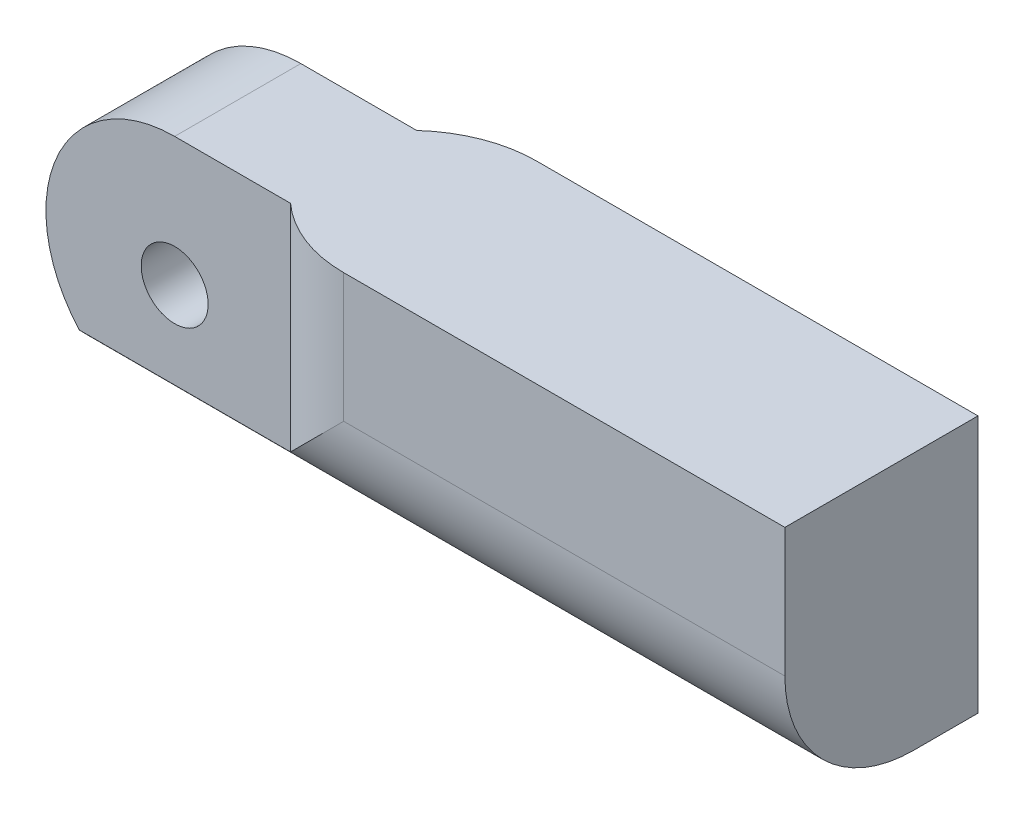
ISO-10303-21;
HEADER;
FILE_DESCRIPTION(('STEP AP214'),'2;1');
FILE_NAME('part.step','',(''),(''),'','','');
FILE_SCHEMA(('AUTOMOTIVE_DESIGN { 1 0 10303 214 1 1 1 1 }'));
ENDSEC;
DATA;
#1=APPLICATION_CONTEXT('core data for automotive mechanical design processes');
#2=APPLICATION_PROTOCOL_DEFINITION('international standard','automotive_design',2000,#1);
#3=PRODUCT_CONTEXT('',#1,'mechanical');
#4=PRODUCT('Part','Part','',(#3));
#5=PRODUCT_RELATED_PRODUCT_CATEGORY('part','',(#4));
#6=PRODUCT_DEFINITION_FORMATION('','',#4);
#7=PRODUCT_DEFINITION_CONTEXT('part definition',#1,'design');
#8=PRODUCT_DEFINITION('design','',#6,#7);
#9=PRODUCT_DEFINITION_SHAPE('','',#8);
#10=(LENGTH_UNIT() NAMED_UNIT(*) SI_UNIT(.MILLI.,.METRE.));
#11=(NAMED_UNIT(*) PLANE_ANGLE_UNIT() SI_UNIT($,.RADIAN.));
#12=(NAMED_UNIT(*) SI_UNIT($,.STERADIAN.) SOLID_ANGLE_UNIT());
#13=UNCERTAINTY_MEASURE_WITH_UNIT(LENGTH_MEASURE(1.E-05),#10,'distance_accuracy_value','');
#14=(GEOMETRIC_REPRESENTATION_CONTEXT(3) GLOBAL_UNCERTAINTY_ASSIGNED_CONTEXT((#13)) GLOBAL_UNIT_ASSIGNED_CONTEXT((#10,
#11,#12)) REPRESENTATION_CONTEXT('',''));
#15=CARTESIAN_POINT('',(0.,0.,0.));
#16=DIRECTION('',(0.,0.,1.));
#17=DIRECTION('',(1.,0.,0.));
#18=AXIS2_PLACEMENT_3D('',#15,#16,#17);
#19=CARTESIAN_POINT('',(0.,10.,4.9));
#20=DIRECTION('',(0.,1.,0.));
#21=DIRECTION('',(0.,0.,1.));
#22=AXIS2_PLACEMENT_3D('',#19,#20,#21);
#23=PLANE('',#22);
#24=DIRECTION('',(1.,0.,0.));
#25=VECTOR('',#24,1.);
#26=CARTESIAN_POINT('',(0.,10.,-7.5));
#27=LINE('',#26,#25);
#28=CARTESIAN_POINT('',(15.7260686883201,10.,-7.5));
#29=VERTEX_POINT('',#28);
#30=CARTESIAN_POINT('',(50.,10.,-7.5));
#31=VERTEX_POINT('',#30);
#32=EDGE_CURVE('E141',#29,#31,#27,.T.);
#33=ORIENTED_EDGE('',*,*,#32,.F.);
#34=CARTESIAN_POINT('',(15.7260686883201,10.,2.5));
#35=DIRECTION('',(0.,1.,0.));
#36=DIRECTION('',(0.,0.,1.));
#37=AXIS2_PLACEMENT_3D('',#34,#35,#36);
#38=CIRCLE('',#37,10.);
#39=CARTESIAN_POINT('',(9.,10.,-4.9));
#40=VERTEX_POINT('',#39);
#41=EDGE_CURVE('E11',#29,#40,#38,.T.);
#42=ORIENTED_EDGE('',*,*,#41,.T.);
#43=DIRECTION('',(1.,0.,0.));
#44=VECTOR('',#43,1.);
#45=CARTESIAN_POINT('',(0.,10.,-4.9));
#46=LINE('',#45,#44);
#47=CARTESIAN_POINT('',(0.,10.,-4.9));
#48=VERTEX_POINT('',#47);
#49=EDGE_CURVE('E172',#48,#40,#46,.T.);
#50=ORIENTED_EDGE('',*,*,#49,.F.);
#51=DIRECTION('',(0.,0.,-1.));
#52=VECTOR('',#51,1.);
#53=CARTESIAN_POINT('',(0.,10.,4.9));
#54=LINE('',#53,#52);
#55=CARTESIAN_POINT('',(0.,10.,4.9));
#56=VERTEX_POINT('',#55);
#57=EDGE_CURVE('E189',#56,#48,#54,.T.);
#58=ORIENTED_EDGE('',*,*,#57,.F.);
#59=DIRECTION('',(1.,0.,0.));
#60=VECTOR('',#59,1.);
#61=CARTESIAN_POINT('',(0.,10.,4.9));
#62=LINE('',#61,#60);
#63=CARTESIAN_POINT('',(9.,10.,4.9));
#64=VERTEX_POINT('',#63);
#65=EDGE_CURVE('E156',#56,#64,#62,.T.);
#66=ORIENTED_EDGE('',*,*,#65,.T.);
#67=CARTESIAN_POINT('',(15.7260686883201,10.,-2.5));
#68=DIRECTION('',(0.,1.,0.));
#69=DIRECTION('',(0.,0.,1.));
#70=AXIS2_PLACEMENT_3D('',#67,#68,#69);
#71=CIRCLE('',#70,10.);
#72=CARTESIAN_POINT('',(15.7260686883201,10.,7.5));
#73=VERTEX_POINT('',#72);
#74=EDGE_CURVE('E55',#64,#73,#71,.T.);
#75=ORIENTED_EDGE('',*,*,#74,.T.);
#76=DIRECTION('',(1.,0.,0.));
#77=VECTOR('',#76,1.);
#78=CARTESIAN_POINT('',(0.,10.,7.5));
#79=LINE('',#78,#77);
#80=CARTESIAN_POINT('',(50.,10.,7.5));
#81=VERTEX_POINT('',#80);
#82=EDGE_CURVE('E118',#73,#81,#79,.T.);
#83=ORIENTED_EDGE('',*,*,#82,.T.);
#84=DIRECTION('',(0.,0.,-1.));
#85=VECTOR('',#84,1.);
#86=CARTESIAN_POINT('',(50.,10.,7.5));
#87=LINE('',#86,#85);
#88=EDGE_CURVE('E120',#81,#31,#87,.T.);
#89=ORIENTED_EDGE('',*,*,#88,.T.);
#90=EDGE_LOOP('',(#33,#42,#50,#58,#66,#75,#83,#89));
#91=FACE_BOUND('',#90,.T.);
#92=ADVANCED_FACE('F45',(#91),#23,.T.);
#93=CARTESIAN_POINT('',(0.,0.,4.9));
#94=DIRECTION('',(0.,0.,-1.));
#95=DIRECTION('',(-1.,0.,0.));
#96=AXIS2_PLACEMENT_3D('',#93,#94,#95);
#97=CYLINDRICAL_SURFACE('',#96,10.);
#98=DIRECTION('',(0.,0.,-1.));
#99=VECTOR('',#98,1.);
#100=CARTESIAN_POINT('',(0.,-10.,4.9));
#101=LINE('',#100,#99);
#102=CARTESIAN_POINT('',(0.,-10.,-2.5));
#103=VERTEX_POINT('',#102);
#104=CARTESIAN_POINT('',(0.,-10.,-4.9));
#105=VERTEX_POINT('',#104);
#106=EDGE_CURVE('E168',#103,#105,#101,.T.);
#107=ORIENTED_EDGE('',*,*,#106,.F.);
#108=CARTESIAN_POINT('',(0.,0.,-2.5));
#109=DIRECTION('',(-0.707106781186547,0.,-0.707106781186547));
#110=DIRECTION('',(-0.707106781186547,0.,0.707106781186547));
#111=AXIS2_PLACEMENT_3D('',#108,#109,#110);
#112=ELLIPSE('',#111,14.1421356237309,10.);
#113=CARTESIAN_POINT('',(-7.4,-6.72606868832009,4.9));
#114=VERTEX_POINT('',#113);
#115=EDGE_CURVE('E199',#103,#114,#112,.T.);
#116=ORIENTED_EDGE('',*,*,#115,.T.);
#117=CARTESIAN_POINT('',(0.,0.,4.9));
#118=DIRECTION('',(0.,0.,1.));
#119=DIRECTION('',(1.,0.,0.));
#120=AXIS2_PLACEMENT_3D('',#117,#118,#119);
#121=CIRCLE('',#120,10.);
#122=EDGE_CURVE('E160',#56,#114,#121,.T.);
#123=ORIENTED_EDGE('',*,*,#122,.F.);
#124=ORIENTED_EDGE('',*,*,#57,.T.);
#125=CARTESIAN_POINT('',(0.,0.,-4.9));
#126=DIRECTION('',(0.,0.,1.));
#127=DIRECTION('',(1.,0.,0.));
#128=AXIS2_PLACEMENT_3D('',#125,#126,#127);
#129=CIRCLE('',#128,10.);
#130=EDGE_CURVE('E176',#48,#105,#129,.T.);
#131=ORIENTED_EDGE('',*,*,#130,.T.);
#132=EDGE_LOOP('',(#107,#116,#123,#124,#131));
#133=FACE_BOUND('',#132,.T.);
#134=ADVANCED_FACE('F227',(#133),#97,.T.);
#135=CARTESIAN_POINT('',(0.,-10.,4.9));
#136=DIRECTION('',(0.,-1.,0.));
#137=DIRECTION('',(1.,0.,0.));
#138=AXIS2_PLACEMENT_3D('',#135,#136,#137);
#139=PLANE('',#138);
#140=DIRECTION('',(0.,0.,-1.));
#141=VECTOR('',#140,1.);
#142=CARTESIAN_POINT('',(50.,-10.,7.5));
#143=LINE('',#142,#141);
#144=CARTESIAN_POINT('',(50.,-10.,-2.5));
#145=VERTEX_POINT('',#144);
#146=CARTESIAN_POINT('',(50.,-10.,-7.5));
#147=VERTEX_POINT('',#146);
#148=EDGE_CURVE('E134',#145,#147,#143,.T.);
#149=ORIENTED_EDGE('',*,*,#148,.F.);
#150=DIRECTION('',(-1.,0.,0.));
#151=VECTOR('',#150,1.);
#152=CARTESIAN_POINT('',(0.,-10.,-2.5));
#153=LINE('',#152,#151);
#154=EDGE_CURVE('E195',#145,#103,#153,.T.);
#155=ORIENTED_EDGE('',*,*,#154,.T.);
#156=ORIENTED_EDGE('',*,*,#106,.T.);
#157=DIRECTION('',(-1.,0.,0.));
#158=VECTOR('',#157,1.);
#159=CARTESIAN_POINT('',(0.,-10.,-4.9));
#160=LINE('',#159,#158);
#161=CARTESIAN_POINT('',(9.,-10.,-4.9));
#162=VERTEX_POINT('',#161);
#163=EDGE_CURVE('E180',#162,#105,#160,.T.);
#164=ORIENTED_EDGE('',*,*,#163,.F.);
#165=CARTESIAN_POINT('',(15.7260686883201,-10.,2.5));
#166=DIRECTION('',(0.,-1.,0.));
#167=DIRECTION('',(1.,0.,0.));
#168=AXIS2_PLACEMENT_3D('',#165,#166,#167);
#169=CIRCLE('',#168,10.);
#170=CARTESIAN_POINT('',(15.7260686883201,-10.,-7.5));
#171=VERTEX_POINT('',#170);
#172=EDGE_CURVE('E192',#162,#171,#169,.T.);
#173=ORIENTED_EDGE('',*,*,#172,.T.);
#174=DIRECTION('',(-1.,0.,0.));
#175=VECTOR('',#174,1.);
#176=CARTESIAN_POINT('',(0.,-10.,-7.5));
#177=LINE('',#176,#175);
#178=EDGE_CURVE('E144',#147,#171,#177,.T.);
#179=ORIENTED_EDGE('',*,*,#178,.F.);
#180=EDGE_LOOP('',(#149,#155,#156,#164,#173,#179));
#181=FACE_BOUND('',#180,.T.);
#182=ADVANCED_FACE('F220',(#181),#139,.T.);
#183=CARTESIAN_POINT('',(0.,0.,4.9));
#184=DIRECTION('',(0.,0.,-1.));
#185=DIRECTION('',(-1.,0.,0.));
#186=AXIS2_PLACEMENT_3D('',#183,#184,#185);
#187=CYLINDRICAL_SURFACE('',#186,2.6);
#188=CARTESIAN_POINT('',(0.,0.,4.9));
#189=DIRECTION('',(0.,0.,1.));
#190=DIRECTION('',(1.,0.,0.));
#191=AXIS2_PLACEMENT_3D('',#188,#189,#190);
#192=CIRCLE('',#191,2.6);
#193=CARTESIAN_POINT('',(2.6,0.,4.9));
#194=VERTEX_POINT('',#193);
#195=EDGE_CURVE('E152',#194,#194,#192,.T.);
#196=ORIENTED_EDGE('',*,*,#195,.T.);
#197=EDGE_LOOP('',(#196));
#198=FACE_BOUND('',#197,.T.);
#199=CARTESIAN_POINT('',(0.,0.,-4.9));
#200=DIRECTION('',(0.,0.,1.));
#201=DIRECTION('',(1.,0.,0.));
#202=AXIS2_PLACEMENT_3D('',#199,#200,#201);
#203=CIRCLE('',#202,2.6);
#204=CARTESIAN_POINT('',(2.6,0.,-4.9));
#205=VERTEX_POINT('',#204);
#206=EDGE_CURVE('E151',#205,#205,#203,.T.);
#207=ORIENTED_EDGE('',*,*,#206,.F.);
#208=EDGE_LOOP('',(#207));
#209=FACE_BOUND('',#208,.T.);
#210=ADVANCED_FACE('F255',(#198,#209),#187,.F.);
#211=CARTESIAN_POINT('',(0.,0.,4.9));
#212=DIRECTION('',(0.,0.,1.));
#213=DIRECTION('',(1.,0.,0.));
#214=AXIS2_PLACEMENT_3D('',#211,#212,#213);
#215=PLANE('',#214);
#216=ORIENTED_EDGE('',*,*,#195,.F.);
#217=EDGE_LOOP('',(#216));
#218=FACE_BOUND('',#217,.T.);
#219=ORIENTED_EDGE('',*,*,#122,.T.);
#220=DIRECTION('',(-1.,0.,0.));
#221=VECTOR('',#220,1.);
#222=CARTESIAN_POINT('',(-7.4,-6.72606868832009,4.9));
#223=LINE('',#222,#221);
#224=CARTESIAN_POINT('',(8.99999999999999,-6.72606868832009,4.9));
#225=VERTEX_POINT('',#224);
#226=EDGE_CURVE('E202',#114,#225,#223,.F.);
#227=ORIENTED_EDGE('',*,*,#226,.T.);
#228=DIRECTION('',(0.,-1.,0.));
#229=VECTOR('',#228,1.);
#230=CARTESIAN_POINT('',(9.,0.,4.9));
#231=LINE('',#230,#229);
#232=EDGE_CURVE('E164',#64,#225,#231,.T.);
#233=ORIENTED_EDGE('',*,*,#232,.F.);
#234=ORIENTED_EDGE('',*,*,#65,.F.);
#235=EDGE_LOOP('',(#219,#227,#233,#234));
#236=FACE_BOUND('',#235,.T.);
#237=ADVANCED_FACE('F230',(#218,#236),#215,.T.);
#238=CARTESIAN_POINT('',(0.,0.,-4.9));
#239=DIRECTION('',(0.,0.,1.));
#240=DIRECTION('',(1.,0.,0.));
#241=AXIS2_PLACEMENT_3D('',#238,#239,#240);
#242=PLANE('',#241);
#243=ORIENTED_EDGE('',*,*,#206,.T.);
#244=EDGE_LOOP('',(#243));
#245=FACE_BOUND('',#244,.T.);
#246=ORIENTED_EDGE('',*,*,#49,.T.);
#247=DIRECTION('',(0.,-1.,0.));
#248=VECTOR('',#247,1.);
#249=CARTESIAN_POINT('',(9.,0.,-4.9));
#250=LINE('',#249,#248);
#251=EDGE_CURVE('E157',#40,#162,#250,.T.);
#252=ORIENTED_EDGE('',*,*,#251,.T.);
#253=ORIENTED_EDGE('',*,*,#163,.T.);
#254=ORIENTED_EDGE('',*,*,#130,.F.);
#255=EDGE_LOOP('',(#246,#252,#253,#254));
#256=FACE_BOUND('',#255,.T.);
#257=ADVANCED_FACE('F235',(#245,#256),#242,.F.);
#258=CARTESIAN_POINT('',(50.,0.,7.5));
#259=DIRECTION('',(1.,0.,0.));
#260=DIRECTION('',(0.,0.,-1.));
#261=AXIS2_PLACEMENT_3D('',#258,#259,#260);
#262=PLANE('',#261);
#263=DIRECTION('',(0.,-1.,0.));
#264=VECTOR('',#263,1.);
#265=CARTESIAN_POINT('',(50.,0.,7.5));
#266=LINE('',#265,#264);
#267=CARTESIAN_POINT('',(50.,0.,7.5));
#268=VERTEX_POINT('',#267);
#269=EDGE_CURVE('E125',#81,#268,#266,.T.);
#270=ORIENTED_EDGE('',*,*,#269,.T.);
#271=CARTESIAN_POINT('',(50.,0.,-2.5));
#272=DIRECTION('',(1.,0.,0.));
#273=DIRECTION('',(0.,0.,-1.));
#274=AXIS2_PLACEMENT_3D('',#271,#272,#273);
#275=CIRCLE('',#274,10.);
#276=EDGE_CURVE('E209',#268,#145,#275,.T.);
#277=ORIENTED_EDGE('',*,*,#276,.T.);
#278=ORIENTED_EDGE('',*,*,#148,.T.);
#279=DIRECTION('',(0.,-1.,0.));
#280=VECTOR('',#279,1.);
#281=CARTESIAN_POINT('',(50.,0.,-7.5));
#282=LINE('',#281,#280);
#283=EDGE_CURVE('E126',#31,#147,#282,.T.);
#284=ORIENTED_EDGE('',*,*,#283,.F.);
#285=ORIENTED_EDGE('',*,*,#88,.F.);
#286=EDGE_LOOP('',(#270,#277,#278,#284,#285));
#287=FACE_BOUND('',#286,.T.);
#288=ADVANCED_FACE('F130',(#287),#262,.T.);
#289=CARTESIAN_POINT('',(0.,0.,7.5));
#290=DIRECTION('',(0.,0.,1.));
#291=DIRECTION('',(1.,0.,0.));
#292=AXIS2_PLACEMENT_3D('',#289,#290,#291);
#293=PLANE('',#292);
#294=DIRECTION('',(0.,1.,0.));
#295=VECTOR('',#294,1.);
#296=CARTESIAN_POINT('',(15.7260686883201,-10.,7.5));
#297=LINE('',#296,#295);
#298=CARTESIAN_POINT('',(15.7260686883201,0.,7.5));
#299=VERTEX_POINT('',#298);
#300=EDGE_CURVE('E70',#73,#299,#297,.F.);
#301=ORIENTED_EDGE('',*,*,#300,.T.);
#302=DIRECTION('',(-1.,0.,0.));
#303=VECTOR('',#302,1.);
#304=CARTESIAN_POINT('',(0.,0.,7.5));
#305=LINE('',#304,#303);
#306=EDGE_CURVE('E137',#299,#268,#305,.F.);
#307=ORIENTED_EDGE('',*,*,#306,.T.);
#308=ORIENTED_EDGE('',*,*,#269,.F.);
#309=ORIENTED_EDGE('',*,*,#82,.F.);
#310=EDGE_LOOP('',(#301,#307,#308,#309));
#311=FACE_BOUND('',#310,.T.);
#312=ADVANCED_FACE('F136',(#311),#293,.T.);
#313=CARTESIAN_POINT('',(0.,0.,-7.5));
#314=DIRECTION('',(0.,0.,1.));
#315=DIRECTION('',(1.,0.,0.));
#316=AXIS2_PLACEMENT_3D('',#313,#314,#315);
#317=PLANE('',#316);
#318=ORIENTED_EDGE('',*,*,#178,.T.);
#319=DIRECTION('',(0.,-1.,0.));
#320=VECTOR('',#319,1.);
#321=CARTESIAN_POINT('',(15.7260686883201,0.,-7.5));
#322=LINE('',#321,#320);
#323=EDGE_CURVE('E62',#171,#29,#322,.F.);
#324=ORIENTED_EDGE('',*,*,#323,.T.);
#325=ORIENTED_EDGE('',*,*,#32,.T.);
#326=ORIENTED_EDGE('',*,*,#283,.T.);
#327=EDGE_LOOP('',(#318,#324,#325,#326));
#328=FACE_BOUND('',#327,.T.);
#329=ADVANCED_FACE('F239',(#328),#317,.F.);
#330=CARTESIAN_POINT('',(15.7260686883201,0.,-2.5));
#331=DIRECTION('',(0.,-1.,0.));
#332=DIRECTION('',(1.,0.,0.));
#333=AXIS2_PLACEMENT_3D('',#330,#331,#332);
#334=CYLINDRICAL_SURFACE('',#333,10.);
#335=ORIENTED_EDGE('',*,*,#74,.F.);
#336=ORIENTED_EDGE('',*,*,#232,.T.);
#337=CARTESIAN_POINT('',(15.7260686883201,0.,-2.5));
#338=DIRECTION('',(0.707106781186547,-0.707106781186547,0.));
#339=DIRECTION('',(-0.707106781186548,-0.707106781186547,0.));
#340=AXIS2_PLACEMENT_3D('',#337,#338,#339);
#341=ELLIPSE('',#340,14.142135623731,10.);
#342=EDGE_CURVE('E49',#299,#225,#341,.T.);
#343=ORIENTED_EDGE('',*,*,#342,.F.);
#344=ORIENTED_EDGE('',*,*,#300,.F.);
#345=EDGE_LOOP('',(#335,#336,#343,#344));
#346=FACE_BOUND('',#345,.T.);
#347=ADVANCED_FACE('F245',(#346),#334,.T.);
#348=CARTESIAN_POINT('',(0.,0.,-2.5));
#349=DIRECTION('',(-1.,0.,0.));
#350=DIRECTION('',(0.,-1.,0.));
#351=AXIS2_PLACEMENT_3D('',#348,#349,#350);
#352=CYLINDRICAL_SURFACE('',#351,10.);
#353=ORIENTED_EDGE('',*,*,#276,.F.);
#354=ORIENTED_EDGE('',*,*,#306,.F.);
#355=ORIENTED_EDGE('',*,*,#342,.T.);
#356=ORIENTED_EDGE('',*,*,#226,.F.);
#357=ORIENTED_EDGE('',*,*,#115,.F.);
#358=ORIENTED_EDGE('',*,*,#154,.F.);
#359=EDGE_LOOP('',(#353,#354,#355,#356,#357,#358));
#360=FACE_BOUND('',#359,.T.);
#361=ADVANCED_FACE('F222',(#360),#352,.T.);
#362=CARTESIAN_POINT('',(15.7260686883201,0.,2.5));
#363=DIRECTION('',(0.,-1.,0.));
#364=DIRECTION('',(1.,0.,0.));
#365=AXIS2_PLACEMENT_3D('',#362,#363,#364);
#366=CYLINDRICAL_SURFACE('',#365,10.);
#367=ORIENTED_EDGE('',*,*,#41,.F.);
#368=ORIENTED_EDGE('',*,*,#323,.F.);
#369=ORIENTED_EDGE('',*,*,#172,.F.);
#370=ORIENTED_EDGE('',*,*,#251,.F.);
#371=EDGE_LOOP('',(#367,#368,#369,#370));
#372=FACE_BOUND('',#371,.T.);
#373=ADVANCED_FACE('F47',(#372),#366,.T.);
#374=CLOSED_SHELL('',(#92,#134,#182,#210,#237,#257,#288,#312,#329,#347,#361,#373));
#375=MANIFOLD_SOLID_BREP('B2',#374);
#376=ADVANCED_BREP_SHAPE_REPRESENTATION('',(#18,#375),#14);
#377=SHAPE_DEFINITION_REPRESENTATION(#9,#376);
ENDSEC;
END-ISO-10303-21;
